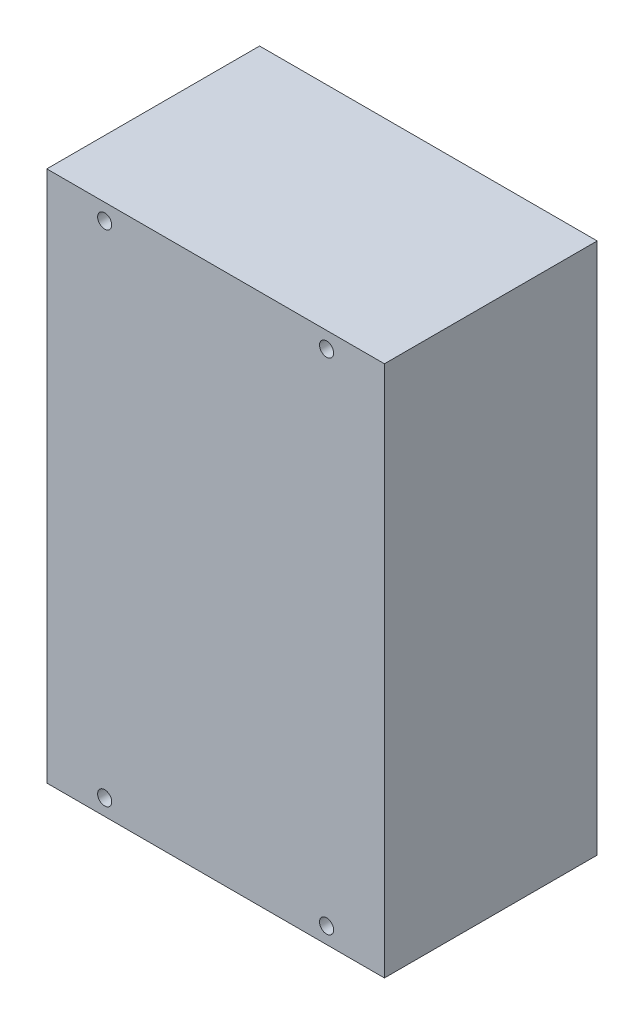
ISO-10303-21;
HEADER;
FILE_DESCRIPTION(('STEP AP214'),'2;1');
FILE_NAME('part.step','',(''),(''),'','','');
FILE_SCHEMA(('AUTOMOTIVE_DESIGN { 1 0 10303 214 1 1 1 1 }'));
ENDSEC;
DATA;
#1=APPLICATION_CONTEXT('core data for automotive mechanical design processes');
#2=APPLICATION_PROTOCOL_DEFINITION('international standard','automotive_design',2000,#1);
#3=PRODUCT_CONTEXT('',#1,'mechanical');
#4=PRODUCT('Part','Part','',(#3));
#5=PRODUCT_RELATED_PRODUCT_CATEGORY('part','',(#4));
#6=PRODUCT_DEFINITION_FORMATION('','',#4);
#7=PRODUCT_DEFINITION_CONTEXT('part definition',#1,'design');
#8=PRODUCT_DEFINITION('design','',#6,#7);
#9=PRODUCT_DEFINITION_SHAPE('','',#8);
#10=(LENGTH_UNIT() NAMED_UNIT(*) SI_UNIT(.MILLI.,.METRE.));
#11=(NAMED_UNIT(*) PLANE_ANGLE_UNIT() SI_UNIT($,.RADIAN.));
#12=(NAMED_UNIT(*) SI_UNIT($,.STERADIAN.) SOLID_ANGLE_UNIT());
#13=UNCERTAINTY_MEASURE_WITH_UNIT(LENGTH_MEASURE(1.E-05),#10,'distance_accuracy_value','');
#14=(GEOMETRIC_REPRESENTATION_CONTEXT(3) GLOBAL_UNCERTAINTY_ASSIGNED_CONTEXT((#13)) GLOBAL_UNIT_ASSIGNED_CONTEXT((#10,
#11,#12)) REPRESENTATION_CONTEXT('',''));
#15=CARTESIAN_POINT('',(0.,0.,0.));
#16=DIRECTION('',(0.,0.,1.));
#17=DIRECTION('',(1.,0.,0.));
#18=AXIS2_PLACEMENT_3D('',#15,#16,#17);
#19=CARTESIAN_POINT('',(0.,0.,49.784));
#20=DIRECTION('',(0.,0.,1.));
#21=DIRECTION('',(1.,0.,0.));
#22=AXIS2_PLACEMENT_3D('',#19,#20,#21);
#23=PLANE('',#22);
#24=CARTESIAN_POINT('',(25.9588,-58.4454,49.784));
#25=DIRECTION('',(0.,0.,1.));
#26=DIRECTION('',(1.,0.,0.));
#27=AXIS2_PLACEMENT_3D('',#24,#25,#26);
#28=CIRCLE('',#27,1.651);
#29=CARTESIAN_POINT('',(27.6098,-58.4454,49.784));
#30=VERTEX_POINT('',#29);
#31=EDGE_CURVE('E124',#30,#30,#28,.T.);
#32=ORIENTED_EDGE('',*,*,#31,.F.);
#33=EDGE_LOOP('',(#32));
#34=FACE_BOUND('',#33,.T.);
#35=CARTESIAN_POINT('',(-25.9588,58.4454,49.784));
#36=DIRECTION('',(0.,0.,1.));
#37=DIRECTION('',(1.,0.,0.));
#38=AXIS2_PLACEMENT_3D('',#35,#36,#37);
#39=CIRCLE('',#38,1.651);
#40=CARTESIAN_POINT('',(-24.3078,58.4454,49.784));
#41=VERTEX_POINT('',#40);
#42=EDGE_CURVE('E103',#41,#41,#39,.T.);
#43=ORIENTED_EDGE('',*,*,#42,.F.);
#44=EDGE_LOOP('',(#43));
#45=FACE_BOUND('',#44,.T.);
#46=DIRECTION('',(0.,1.,0.));
#47=VECTOR('',#46,1.);
#48=CARTESIAN_POINT('',(39.497,62.23,49.784));
#49=LINE('',#48,#47);
#50=CARTESIAN_POINT('',(39.497,-62.23,49.784));
#51=VERTEX_POINT('',#50);
#52=CARTESIAN_POINT('',(39.497,62.23,49.784));
#53=VERTEX_POINT('',#52);
#54=EDGE_CURVE('E88',#51,#53,#49,.T.);
#55=ORIENTED_EDGE('',*,*,#54,.T.);
#56=DIRECTION('',(-1.,0.,0.));
#57=VECTOR('',#56,1.);
#58=CARTESIAN_POINT('',(-39.497,62.23,49.784));
#59=LINE('',#58,#57);
#60=CARTESIAN_POINT('',(-39.497,62.23,49.784));
#61=VERTEX_POINT('',#60);
#62=EDGE_CURVE('E83',#53,#61,#59,.T.);
#63=ORIENTED_EDGE('',*,*,#62,.T.);
#64=DIRECTION('',(0.,-1.,0.));
#65=VECTOR('',#64,1.);
#66=CARTESIAN_POINT('',(-39.497,62.23,49.784));
#67=LINE('',#66,#65);
#68=CARTESIAN_POINT('',(-39.497,-62.23,49.784));
#69=VERTEX_POINT('',#68);
#70=EDGE_CURVE('E86',#61,#69,#67,.T.);
#71=ORIENTED_EDGE('',*,*,#70,.T.);
#72=DIRECTION('',(1.,0.,0.));
#73=VECTOR('',#72,1.);
#74=CARTESIAN_POINT('',(-39.497,-62.23,49.784));
#75=LINE('',#74,#73);
#76=EDGE_CURVE('E53',#69,#51,#75,.T.);
#77=ORIENTED_EDGE('',*,*,#76,.T.);
#78=EDGE_LOOP('',(#55,#63,#71,#77));
#79=FACE_BOUND('',#78,.T.);
#80=CARTESIAN_POINT('',(25.9588,58.4454,49.784));
#81=DIRECTION('',(0.,0.,1.));
#82=DIRECTION('',(-1.,0.,0.));
#83=AXIS2_PLACEMENT_3D('',#80,#81,#82);
#84=CIRCLE('',#83,1.651);
#85=CARTESIAN_POINT('',(24.3078,58.4454,49.784));
#86=VERTEX_POINT('',#85);
#87=EDGE_CURVE('E118',#86,#86,#84,.T.);
#88=ORIENTED_EDGE('',*,*,#87,.F.);
#89=EDGE_LOOP('',(#88));
#90=FACE_BOUND('',#89,.T.);
#91=CARTESIAN_POINT('',(-25.9588,-58.4454,49.784));
#92=DIRECTION('',(0.,0.,1.));
#93=DIRECTION('',(-1.,0.,0.));
#94=AXIS2_PLACEMENT_3D('',#91,#92,#93);
#95=CIRCLE('',#94,1.651);
#96=CARTESIAN_POINT('',(-27.6098,-58.4454,49.784));
#97=VERTEX_POINT('',#96);
#98=EDGE_CURVE('E130',#97,#97,#95,.T.);
#99=ORIENTED_EDGE('',*,*,#98,.F.);
#100=EDGE_LOOP('',(#99));
#101=FACE_BOUND('',#100,.T.);
#102=ADVANCED_FACE('F36',(#34,#45,#79,#90,#101),#23,.T.);
#103=CARTESIAN_POINT('',(0.,0.,0.));
#104=DIRECTION('',(0.,0.,1.));
#105=DIRECTION('',(1.,0.,0.));
#106=AXIS2_PLACEMENT_3D('',#103,#104,#105);
#107=PLANE('',#106);
#108=DIRECTION('',(0.,1.,0.));
#109=VECTOR('',#108,1.);
#110=CARTESIAN_POINT('',(39.497,62.23,0.));
#111=LINE('',#110,#109);
#112=CARTESIAN_POINT('',(39.497,-62.23,0.));
#113=VERTEX_POINT('',#112);
#114=CARTESIAN_POINT('',(39.497,62.23,0.));
#115=VERTEX_POINT('',#114);
#116=EDGE_CURVE('E100',#113,#115,#111,.T.);
#117=ORIENTED_EDGE('',*,*,#116,.F.);
#118=DIRECTION('',(1.,0.,0.));
#119=VECTOR('',#118,1.);
#120=CARTESIAN_POINT('',(-39.497,-62.23,0.));
#121=LINE('',#120,#119);
#122=CARTESIAN_POINT('',(-39.497,-62.23,0.));
#123=VERTEX_POINT('',#122);
#124=EDGE_CURVE('E76',#123,#113,#121,.T.);
#125=ORIENTED_EDGE('',*,*,#124,.F.);
#126=DIRECTION('',(0.,-1.,0.));
#127=VECTOR('',#126,1.);
#128=CARTESIAN_POINT('',(-39.497,62.23,0.));
#129=LINE('',#128,#127);
#130=CARTESIAN_POINT('',(-39.497,62.23,0.));
#131=VERTEX_POINT('',#130);
#132=EDGE_CURVE('E70',#131,#123,#129,.T.);
#133=ORIENTED_EDGE('',*,*,#132,.F.);
#134=DIRECTION('',(-1.,0.,0.));
#135=VECTOR('',#134,1.);
#136=CARTESIAN_POINT('',(-39.497,62.23,0.));
#137=LINE('',#136,#135);
#138=EDGE_CURVE('E92',#115,#131,#137,.T.);
#139=ORIENTED_EDGE('',*,*,#138,.F.);
#140=EDGE_LOOP('',(#117,#125,#133,#139));
#141=FACE_BOUND('',#140,.T.);
#142=CARTESIAN_POINT('',(-25.9588,58.4454,0.));
#143=DIRECTION('',(0.,0.,1.));
#144=DIRECTION('',(1.,0.,0.));
#145=AXIS2_PLACEMENT_3D('',#142,#143,#144);
#146=CIRCLE('',#145,1.651);
#147=CARTESIAN_POINT('',(-24.3078,58.4454,0.));
#148=VERTEX_POINT('',#147);
#149=EDGE_CURVE('E115',#148,#148,#146,.T.);
#150=ORIENTED_EDGE('',*,*,#149,.T.);
#151=EDGE_LOOP('',(#150));
#152=FACE_BOUND('',#151,.T.);
#153=CARTESIAN_POINT('',(25.9588,58.4454,0.));
#154=DIRECTION('',(0.,0.,1.));
#155=DIRECTION('',(-1.,0.,0.));
#156=AXIS2_PLACEMENT_3D('',#153,#154,#155);
#157=CIRCLE('',#156,1.651);
#158=CARTESIAN_POINT('',(24.3078,58.4454,0.));
#159=VERTEX_POINT('',#158);
#160=EDGE_CURVE('E121',#159,#159,#157,.T.);
#161=ORIENTED_EDGE('',*,*,#160,.T.);
#162=EDGE_LOOP('',(#161));
#163=FACE_BOUND('',#162,.T.);
#164=CARTESIAN_POINT('',(25.9588,-58.4454,0.));
#165=DIRECTION('',(0.,0.,1.));
#166=DIRECTION('',(1.,0.,0.));
#167=AXIS2_PLACEMENT_3D('',#164,#165,#166);
#168=CIRCLE('',#167,1.651);
#169=CARTESIAN_POINT('',(27.6098,-58.4454,0.));
#170=VERTEX_POINT('',#169);
#171=EDGE_CURVE('E127',#170,#170,#168,.T.);
#172=ORIENTED_EDGE('',*,*,#171,.T.);
#173=EDGE_LOOP('',(#172));
#174=FACE_BOUND('',#173,.T.);
#175=CARTESIAN_POINT('',(-25.9588,-58.4454,0.));
#176=DIRECTION('',(0.,0.,1.));
#177=DIRECTION('',(-1.,0.,0.));
#178=AXIS2_PLACEMENT_3D('',#175,#176,#177);
#179=CIRCLE('',#178,1.651);
#180=CARTESIAN_POINT('',(-27.6098,-58.4454,0.));
#181=VERTEX_POINT('',#180);
#182=EDGE_CURVE('E133',#181,#181,#179,.T.);
#183=ORIENTED_EDGE('',*,*,#182,.T.);
#184=EDGE_LOOP('',(#183));
#185=FACE_BOUND('',#184,.T.);
#186=ADVANCED_FACE('F111',(#141,#152,#163,#174,#185),#107,.F.);
#187=CARTESIAN_POINT('',(39.497,62.23,49.784));
#188=DIRECTION('',(-1.,0.,0.));
#189=DIRECTION('',(0.,0.,1.));
#190=AXIS2_PLACEMENT_3D('',#187,#188,#189);
#191=PLANE('',#190);
#192=ORIENTED_EDGE('',*,*,#116,.T.);
#193=DIRECTION('',(0.,0.,-1.));
#194=VECTOR('',#193,1.);
#195=CARTESIAN_POINT('',(39.497,62.23,49.784));
#196=LINE('',#195,#194);
#197=EDGE_CURVE('E11',#53,#115,#196,.T.);
#198=ORIENTED_EDGE('',*,*,#197,.F.);
#199=ORIENTED_EDGE('',*,*,#54,.F.);
#200=DIRECTION('',(0.,0.,-1.));
#201=VECTOR('',#200,1.);
#202=CARTESIAN_POINT('',(39.497,-62.23,49.784));
#203=LINE('',#202,#201);
#204=EDGE_CURVE('E96',#51,#113,#203,.T.);
#205=ORIENTED_EDGE('',*,*,#204,.T.);
#206=EDGE_LOOP('',(#192,#198,#199,#205));
#207=FACE_BOUND('',#206,.T.);
#208=ADVANCED_FACE('F38',(#207),#191,.F.);
#209=CARTESIAN_POINT('',(-39.497,62.23,49.784));
#210=DIRECTION('',(0.,-1.,0.));
#211=DIRECTION('',(1.,0.,0.));
#212=AXIS2_PLACEMENT_3D('',#209,#210,#211);
#213=PLANE('',#212);
#214=ORIENTED_EDGE('',*,*,#138,.T.);
#215=DIRECTION('',(0.,0.,-1.));
#216=VECTOR('',#215,1.);
#217=CARTESIAN_POINT('',(-39.497,62.23,49.784));
#218=LINE('',#217,#216);
#219=EDGE_CURVE('E45',#61,#131,#218,.T.);
#220=ORIENTED_EDGE('',*,*,#219,.F.);
#221=ORIENTED_EDGE('',*,*,#62,.F.);
#222=ORIENTED_EDGE('',*,*,#197,.T.);
#223=EDGE_LOOP('',(#214,#220,#221,#222));
#224=FACE_BOUND('',#223,.T.);
#225=ADVANCED_FACE('F91',(#224),#213,.F.);
#226=CARTESIAN_POINT('',(-39.497,62.23,49.784));
#227=DIRECTION('',(1.,0.,0.));
#228=DIRECTION('',(0.,0.,-1.));
#229=AXIS2_PLACEMENT_3D('',#226,#227,#228);
#230=PLANE('',#229);
#231=ORIENTED_EDGE('',*,*,#132,.T.);
#232=DIRECTION('',(0.,0.,-1.));
#233=VECTOR('',#232,1.);
#234=CARTESIAN_POINT('',(-39.497,-62.23,49.784));
#235=LINE('',#234,#233);
#236=EDGE_CURVE('E93',#69,#123,#235,.T.);
#237=ORIENTED_EDGE('',*,*,#236,.F.);
#238=ORIENTED_EDGE('',*,*,#70,.F.);
#239=ORIENTED_EDGE('',*,*,#219,.T.);
#240=EDGE_LOOP('',(#231,#237,#238,#239));
#241=FACE_BOUND('',#240,.T.);
#242=ADVANCED_FACE('F94',(#241),#230,.F.);
#243=CARTESIAN_POINT('',(-39.497,-62.23,49.784));
#244=DIRECTION('',(0.,1.,0.));
#245=DIRECTION('',(-1.,0.,0.));
#246=AXIS2_PLACEMENT_3D('',#243,#244,#245);
#247=PLANE('',#246);
#248=ORIENTED_EDGE('',*,*,#124,.T.);
#249=ORIENTED_EDGE('',*,*,#204,.F.);
#250=ORIENTED_EDGE('',*,*,#76,.F.);
#251=ORIENTED_EDGE('',*,*,#236,.T.);
#252=EDGE_LOOP('',(#248,#249,#250,#251));
#253=FACE_BOUND('',#252,.T.);
#254=ADVANCED_FACE('F108',(#253),#247,.F.);
#255=CARTESIAN_POINT('',(-25.9588,58.4454,49.784));
#256=DIRECTION('',(0.,0.,-1.));
#257=DIRECTION('',(-1.,0.,0.));
#258=AXIS2_PLACEMENT_3D('',#255,#256,#257);
#259=CYLINDRICAL_SURFACE('',#258,1.651);
#260=ORIENTED_EDGE('',*,*,#42,.T.);
#261=EDGE_LOOP('',(#260));
#262=FACE_BOUND('',#261,.T.);
#263=ORIENTED_EDGE('',*,*,#149,.F.);
#264=EDGE_LOOP('',(#263));
#265=FACE_BOUND('',#264,.T.);
#266=ADVANCED_FACE('F152',(#262,#265),#259,.F.);
#267=CARTESIAN_POINT('',(25.9588,58.4454,49.784));
#268=DIRECTION('',(0.,0.,-1.));
#269=DIRECTION('',(-1.,0.,0.));
#270=AXIS2_PLACEMENT_3D('',#267,#268,#269);
#271=CYLINDRICAL_SURFACE('',#270,1.651);
#272=ORIENTED_EDGE('',*,*,#87,.T.);
#273=EDGE_LOOP('',(#272));
#274=FACE_BOUND('',#273,.T.);
#275=ORIENTED_EDGE('',*,*,#160,.F.);
#276=EDGE_LOOP('',(#275));
#277=FACE_BOUND('',#276,.T.);
#278=ADVANCED_FACE('F198',(#274,#277),#271,.F.);
#279=CARTESIAN_POINT('',(25.9588,-58.4454,49.784));
#280=DIRECTION('',(0.,0.,-1.));
#281=DIRECTION('',(-1.,0.,0.));
#282=AXIS2_PLACEMENT_3D('',#279,#280,#281);
#283=CYLINDRICAL_SURFACE('',#282,1.651);
#284=ORIENTED_EDGE('',*,*,#31,.T.);
#285=EDGE_LOOP('',(#284));
#286=FACE_BOUND('',#285,.T.);
#287=ORIENTED_EDGE('',*,*,#171,.F.);
#288=EDGE_LOOP('',(#287));
#289=FACE_BOUND('',#288,.T.);
#290=ADVANCED_FACE('F206',(#286,#289),#283,.F.);
#291=CARTESIAN_POINT('',(-25.9588,-58.4454,49.784));
#292=DIRECTION('',(0.,0.,-1.));
#293=DIRECTION('',(-1.,0.,0.));
#294=AXIS2_PLACEMENT_3D('',#291,#292,#293);
#295=CYLINDRICAL_SURFACE('',#294,1.651);
#296=ORIENTED_EDGE('',*,*,#98,.T.);
#297=EDGE_LOOP('',(#296));
#298=FACE_BOUND('',#297,.T.);
#299=ORIENTED_EDGE('',*,*,#182,.F.);
#300=EDGE_LOOP('',(#299));
#301=FACE_BOUND('',#300,.T.);
#302=ADVANCED_FACE('F139',(#298,#301),#295,.F.);
#303=CLOSED_SHELL('',(#102,#186,#208,#225,#242,#254,#266,#278,#290,#302));
#304=MANIFOLD_SOLID_BREP('B2',#303);
#305=ADVANCED_BREP_SHAPE_REPRESENTATION('',(#18,#304),#14);
#306=SHAPE_DEFINITION_REPRESENTATION(#9,#305);
ENDSEC;
END-ISO-10303-21;
